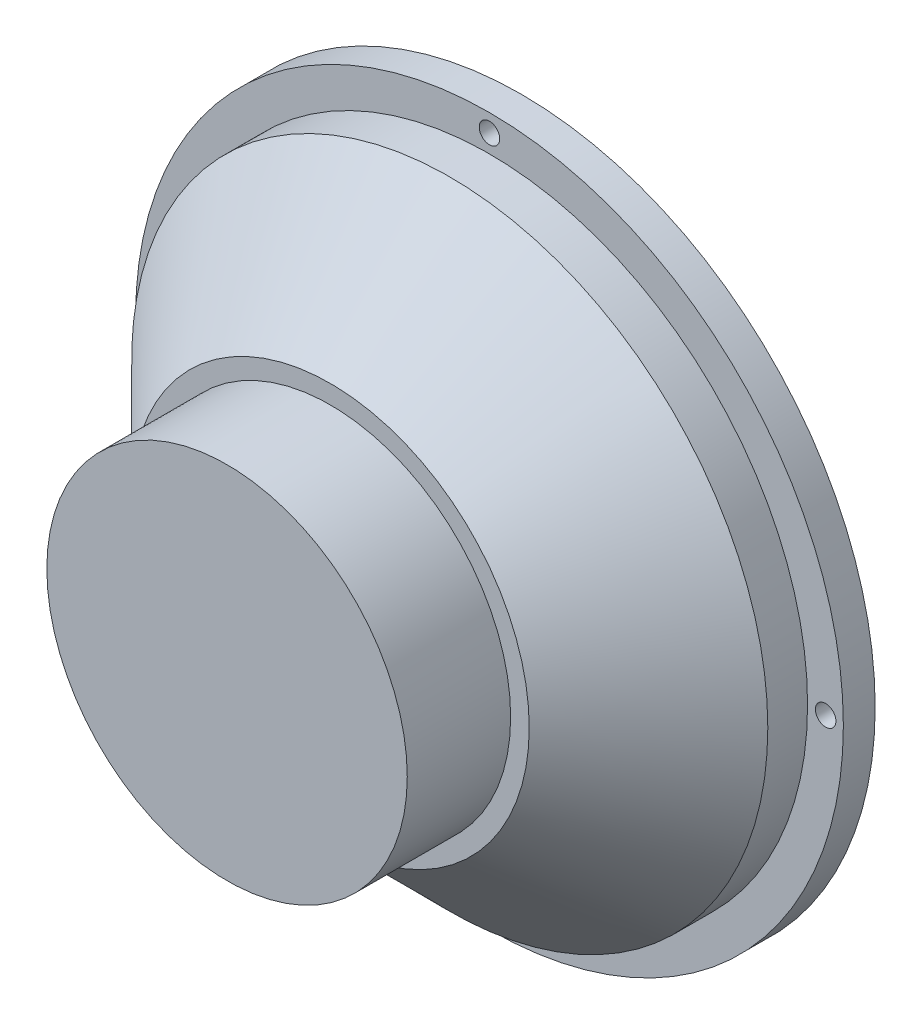
ISO-10303-21;
HEADER;
FILE_DESCRIPTION(('STEP AP214'),'2;1');
FILE_NAME('part.step','',(''),(''),'','','');
FILE_SCHEMA(('AUTOMOTIVE_DESIGN { 1 0 10303 214 1 1 1 1 }'));
ENDSEC;
DATA;
#1=APPLICATION_CONTEXT('core data for automotive mechanical design processes');
#2=APPLICATION_PROTOCOL_DEFINITION('international standard','automotive_design',2000,#1);
#3=PRODUCT_CONTEXT('',#1,'mechanical');
#4=PRODUCT('Part','Part','',(#3));
#5=PRODUCT_RELATED_PRODUCT_CATEGORY('part','',(#4));
#6=PRODUCT_DEFINITION_FORMATION('','',#4);
#7=PRODUCT_DEFINITION_CONTEXT('part definition',#1,'design');
#8=PRODUCT_DEFINITION('design','',#6,#7);
#9=PRODUCT_DEFINITION_SHAPE('','',#8);
#10=(LENGTH_UNIT() NAMED_UNIT(*) SI_UNIT(.MILLI.,.METRE.));
#11=(NAMED_UNIT(*) PLANE_ANGLE_UNIT() SI_UNIT($,.RADIAN.));
#12=(NAMED_UNIT(*) SI_UNIT($,.STERADIAN.) SOLID_ANGLE_UNIT());
#13=UNCERTAINTY_MEASURE_WITH_UNIT(LENGTH_MEASURE(1.E-05),#10,'distance_accuracy_value','');
#14=(GEOMETRIC_REPRESENTATION_CONTEXT(3) GLOBAL_UNCERTAINTY_ASSIGNED_CONTEXT((#13)) GLOBAL_UNIT_ASSIGNED_CONTEXT((#10,
#11,#12)) REPRESENTATION_CONTEXT('',''));
#15=CARTESIAN_POINT('',(0.,0.,0.));
#16=DIRECTION('',(0.,0.,1.));
#17=DIRECTION('',(1.,0.,0.));
#18=AXIS2_PLACEMENT_3D('',#15,#16,#17);
#19=CARTESIAN_POINT('',(0.,0.,8.));
#20=DIRECTION('',(0.,0.,-1.));
#21=DIRECTION('',(-1.,0.,0.));
#22=AXIS2_PLACEMENT_3D('',#19,#20,#21);
#23=CYLINDRICAL_SURFACE('',#22,89.);
#24=CARTESIAN_POINT('',(0.,0.,8.));
#25=DIRECTION('',(0.,0.,1.));
#26=DIRECTION('',(1.,0.,0.));
#27=AXIS2_PLACEMENT_3D('',#24,#25,#26);
#28=CIRCLE('',#27,89.);
#29=CARTESIAN_POINT('',(89.,0.,8.));
#30=VERTEX_POINT('',#29);
#31=EDGE_CURVE('E76',#30,#30,#28,.T.);
#32=ORIENTED_EDGE('',*,*,#31,.F.);
#33=EDGE_LOOP('',(#32));
#34=FACE_BOUND('',#33,.T.);
#35=CARTESIAN_POINT('',(0.,0.,0.));
#36=DIRECTION('',(0.,0.,1.));
#37=DIRECTION('',(1.,0.,0.));
#38=AXIS2_PLACEMENT_3D('',#35,#36,#37);
#39=CIRCLE('',#38,89.);
#40=CARTESIAN_POINT('',(89.,0.,0.));
#41=VERTEX_POINT('',#40);
#42=EDGE_CURVE('E80',#41,#41,#39,.T.);
#43=ORIENTED_EDGE('',*,*,#42,.T.);
#44=EDGE_LOOP('',(#43));
#45=FACE_BOUND('',#44,.T.);
#46=ADVANCED_FACE('F50',(#34,#45),#23,.T.);
#47=CARTESIAN_POINT('',(0.,0.,8.));
#48=DIRECTION('',(0.,0.,1.));
#49=DIRECTION('',(1.,0.,0.));
#50=AXIS2_PLACEMENT_3D('',#47,#48,#49);
#51=PLANE('',#50);
#52=CARTESIAN_POINT('',(3.26270494296871E-12,84.5479564843403,8.));
#53=DIRECTION('',(0.,0.,1.));
#54=DIRECTION('',(1.,0.,0.));
#55=AXIS2_PLACEMENT_3D('',#52,#53,#54);
#56=CIRCLE('',#55,2.57454191486641);
#57=CARTESIAN_POINT('',(2.57454191486967,84.5479564843403,8.));
#58=VERTEX_POINT('',#57);
#59=EDGE_CURVE('E92',#58,#58,#56,.T.);
#60=ORIENTED_EDGE('',*,*,#59,.F.);
#61=EDGE_LOOP('',(#60));
#62=FACE_BOUND('',#61,.T.);
#63=CARTESIAN_POINT('',(84.5479564843427,-8.75238698478862E-13,8.));
#64=DIRECTION('',(0.,0.,1.));
#65=DIRECTION('',(1.,0.,0.));
#66=AXIS2_PLACEMENT_3D('',#63,#64,#65);
#67=CIRCLE('',#66,2.57454191486828);
#68=CARTESIAN_POINT('',(87.122498399211,-8.75238698478862E-13,8.));
#69=VERTEX_POINT('',#68);
#70=EDGE_CURVE('E240',#69,#69,#67,.T.);
#71=ORIENTED_EDGE('',*,*,#70,.F.);
#72=EDGE_LOOP('',(#71));
#73=FACE_BOUND('',#72,.T.);
#74=CARTESIAN_POINT('',(1.51222754601099E-12,-84.5479564843403,8.));
#75=DIRECTION('',(0.,0.,1.));
#76=DIRECTION('',(1.,0.,0.));
#77=AXIS2_PLACEMENT_3D('',#74,#75,#76);
#78=CIRCLE('',#77,2.57454191487154);
#79=CARTESIAN_POINT('',(2.57454191487305,-84.5479564843403,8.));
#80=VERTEX_POINT('',#79);
#81=EDGE_CURVE('E244',#80,#80,#78,.T.);
#82=ORIENTED_EDGE('',*,*,#81,.F.);
#83=EDGE_LOOP('',(#82));
#84=FACE_BOUND('',#83,.T.);
#85=CARTESIAN_POINT('',(-84.547956484338,8.85592836907162E-13,8.));
#86=DIRECTION('',(0.,0.,1.));
#87=DIRECTION('',(1.,0.,0.));
#88=AXIS2_PLACEMENT_3D('',#85,#86,#87);
#89=CIRCLE('',#88,2.57454191487022);
#90=CARTESIAN_POINT('',(-81.9734145694678,8.85592836907162E-13,8.));
#91=VERTEX_POINT('',#90);
#92=EDGE_CURVE('E249',#91,#91,#89,.T.);
#93=ORIENTED_EDGE('',*,*,#92,.F.);
#94=EDGE_LOOP('',(#93));
#95=FACE_BOUND('',#94,.T.);
#96=CARTESIAN_POINT('',(0.,0.,8.));
#97=DIRECTION('',(0.,0.,1.));
#98=DIRECTION('',(1.,0.,0.));
#99=AXIS2_PLACEMENT_3D('',#96,#97,#98);
#100=CIRCLE('',#99,80.);
#101=CARTESIAN_POINT('',(80.,0.,8.));
#102=VERTEX_POINT('',#101);
#103=EDGE_CURVE('E72',#102,#102,#100,.T.);
#104=ORIENTED_EDGE('',*,*,#103,.F.);
#105=EDGE_LOOP('',(#104));
#106=FACE_BOUND('',#105,.T.);
#107=ORIENTED_EDGE('',*,*,#31,.T.);
#108=EDGE_LOOP('',(#107));
#109=FACE_BOUND('',#108,.T.);
#110=ADVANCED_FACE('F123',(#62,#73,#84,#95,#106,#109),#51,.T.);
#111=CARTESIAN_POINT('',(0.,0.,0.));
#112=DIRECTION('',(0.,0.,1.));
#113=DIRECTION('',(1.,0.,0.));
#114=AXIS2_PLACEMENT_3D('',#111,#112,#113);
#115=PLANE('',#114);
#116=CARTESIAN_POINT('',(3.26270494296871E-12,84.5479564843403,0.));
#117=DIRECTION('',(0.,0.,1.));
#118=DIRECTION('',(1.,0.,0.));
#119=AXIS2_PLACEMENT_3D('',#116,#117,#118);
#120=CIRCLE('',#119,2.57454191486641);
#121=CARTESIAN_POINT('',(2.57454191486967,84.5479564843403,0.));
#122=VERTEX_POINT('',#121);
#123=EDGE_CURVE('E55',#122,#122,#120,.T.);
#124=ORIENTED_EDGE('',*,*,#123,.T.);
#125=EDGE_LOOP('',(#124));
#126=FACE_BOUND('',#125,.T.);
#127=CARTESIAN_POINT('',(84.5479564843427,-8.75238698478862E-13,0.));
#128=DIRECTION('',(0.,0.,1.));
#129=DIRECTION('',(1.,0.,0.));
#130=AXIS2_PLACEMENT_3D('',#127,#128,#129);
#131=CIRCLE('',#130,2.57454191486828);
#132=CARTESIAN_POINT('',(87.122498399211,-8.75238698478862E-13,0.));
#133=VERTEX_POINT('',#132);
#134=EDGE_CURVE('E95',#133,#133,#131,.T.);
#135=ORIENTED_EDGE('',*,*,#134,.T.);
#136=EDGE_LOOP('',(#135));
#137=FACE_BOUND('',#136,.T.);
#138=CARTESIAN_POINT('',(1.51222754601099E-12,-84.5479564843403,0.));
#139=DIRECTION('',(0.,0.,1.));
#140=DIRECTION('',(1.,0.,0.));
#141=AXIS2_PLACEMENT_3D('',#138,#139,#140);
#142=CIRCLE('',#141,2.57454191487154);
#143=CARTESIAN_POINT('',(2.57454191487305,-84.5479564843403,0.));
#144=VERTEX_POINT('',#143);
#145=EDGE_CURVE('E91',#144,#144,#142,.T.);
#146=ORIENTED_EDGE('',*,*,#145,.T.);
#147=EDGE_LOOP('',(#146));
#148=FACE_BOUND('',#147,.T.);
#149=CARTESIAN_POINT('',(-84.547956484338,8.85592836907162E-13,0.));
#150=DIRECTION('',(0.,0.,1.));
#151=DIRECTION('',(1.,0.,0.));
#152=AXIS2_PLACEMENT_3D('',#149,#150,#151);
#153=CIRCLE('',#152,2.57454191487022);
#154=CARTESIAN_POINT('',(-81.9734145694678,8.85592836907162E-13,0.));
#155=VERTEX_POINT('',#154);
#156=EDGE_CURVE('E87',#155,#155,#153,.T.);
#157=ORIENTED_EDGE('',*,*,#156,.T.);
#158=EDGE_LOOP('',(#157));
#159=FACE_BOUND('',#158,.T.);
#160=ORIENTED_EDGE('',*,*,#42,.F.);
#161=EDGE_LOOP('',(#160));
#162=FACE_BOUND('',#161,.T.);
#163=ADVANCED_FACE('F129',(#126,#137,#148,#159,#162),#115,.F.);
#164=CARTESIAN_POINT('',(0.,0.,48.));
#165=DIRECTION('',(0.,0.,-1.));
#166=DIRECTION('',(-1.,0.,0.));
#167=AXIS2_PLACEMENT_3D('',#164,#165,#166);
#168=CYLINDRICAL_SURFACE('',#167,80.);
#169=CARTESIAN_POINT('',(0.,0.,17.9999999999999));
#170=DIRECTION('',(0.,0.,1.));
#171=DIRECTION('',(1.,0.,0.));
#172=AXIS2_PLACEMENT_3D('',#169,#170,#171);
#173=CIRCLE('',#172,80.);
#174=CARTESIAN_POINT('',(80.,0.,17.9999999999999));
#175=VERTEX_POINT('',#174);
#176=EDGE_CURVE('E60',#175,#175,#173,.F.);
#177=ORIENTED_EDGE('',*,*,#176,.T.);
#178=EDGE_LOOP('',(#177));
#179=FACE_BOUND('',#178,.T.);
#180=ORIENTED_EDGE('',*,*,#103,.T.);
#181=EDGE_LOOP('',(#180));
#182=FACE_BOUND('',#181,.T.);
#183=ADVANCED_FACE('F136',(#179,#182),#168,.T.);
#184=CARTESIAN_POINT('',(0.,0.,48.));
#185=DIRECTION('',(0.,0.,1.));
#186=DIRECTION('',(1.,0.,0.));
#187=AXIS2_PLACEMENT_3D('',#184,#185,#186);
#188=PLANE('',#187);
#189=CARTESIAN_POINT('',(0.,0.,48.));
#190=DIRECTION('',(0.,0.,1.));
#191=DIRECTION('',(1.,0.,0.));
#192=AXIS2_PLACEMENT_3D('',#189,#190,#191);
#193=CIRCLE('',#192,45.325276546488);
#194=CARTESIAN_POINT('',(45.325276546488,0.,48.));
#195=VERTEX_POINT('',#194);
#196=EDGE_CURVE('E10',#195,#195,#193,.T.);
#197=ORIENTED_EDGE('',*,*,#196,.F.);
#198=EDGE_LOOP('',(#197));
#199=FACE_BOUND('',#198,.T.);
#200=CARTESIAN_POINT('',(0.,0.,48.));
#201=DIRECTION('',(0.,0.,1.));
#202=DIRECTION('',(1.,0.,0.));
#203=AXIS2_PLACEMENT_3D('',#200,#201,#202);
#204=CIRCLE('',#203,50.);
#205=CARTESIAN_POINT('',(50.,0.,48.));
#206=VERTEX_POINT('',#205);
#207=EDGE_CURVE('E66',#206,#206,#204,.T.);
#208=ORIENTED_EDGE('',*,*,#207,.T.);
#209=EDGE_LOOP('',(#208));
#210=FACE_BOUND('',#209,.T.);
#211=ADVANCED_FACE('F119',(#199,#210),#188,.T.);
#212=CARTESIAN_POINT('',(0.,0.,48.));
#213=DIRECTION('',(0.,0.,-1.));
#214=DIRECTION('',(-1.,0.,0.));
#215=AXIS2_PLACEMENT_3D('',#212,#213,#214);
#216=CONICAL_SURFACE('',#215,50.,0.785398163397447);
#217=ORIENTED_EDGE('',*,*,#176,.F.);
#218=EDGE_LOOP('',(#217));
#219=FACE_BOUND('',#218,.T.);
#220=ORIENTED_EDGE('',*,*,#207,.F.);
#221=EDGE_LOOP('',(#220));
#222=FACE_BOUND('',#221,.T.);
#223=ADVANCED_FACE('F53',(#219,#222),#216,.T.);
#224=CARTESIAN_POINT('',(0.,0.,74.));
#225=DIRECTION('',(0.,0.,-1.));
#226=DIRECTION('',(-1.,0.,0.));
#227=AXIS2_PLACEMENT_3D('',#224,#225,#226);
#228=CYLINDRICAL_SURFACE('',#227,45.325276546488);
#229=CARTESIAN_POINT('',(0.,0.,74.));
#230=DIRECTION('',(0.,0.,1.));
#231=DIRECTION('',(1.,0.,0.));
#232=AXIS2_PLACEMENT_3D('',#229,#230,#231);
#233=CIRCLE('',#232,45.325276546488);
#234=CARTESIAN_POINT('',(45.325276546488,0.,74.));
#235=VERTEX_POINT('',#234);
#236=EDGE_CURVE('E70',#235,#235,#233,.T.);
#237=ORIENTED_EDGE('',*,*,#236,.F.);
#238=EDGE_LOOP('',(#237));
#239=FACE_BOUND('',#238,.T.);
#240=ORIENTED_EDGE('',*,*,#196,.T.);
#241=EDGE_LOOP('',(#240));
#242=FACE_BOUND('',#241,.T.);
#243=ADVANCED_FACE('F110',(#239,#242),#228,.T.);
#244=CARTESIAN_POINT('',(0.,0.,74.));
#245=DIRECTION('',(0.,0.,1.));
#246=DIRECTION('',(1.,0.,0.));
#247=AXIS2_PLACEMENT_3D('',#244,#245,#246);
#248=PLANE('',#247);
#249=ORIENTED_EDGE('',*,*,#236,.T.);
#250=EDGE_LOOP('',(#249));
#251=FACE_BOUND('',#250,.T.);
#252=ADVANCED_FACE('F108',(#251),#248,.T.);
#253=CARTESIAN_POINT('',(-84.547956484338,8.85592836907162E-13,-18.));
#254=DIRECTION('',(0.,0.,1.));
#255=DIRECTION('',(1.,0.,0.));
#256=AXIS2_PLACEMENT_3D('',#253,#254,#255);
#257=CYLINDRICAL_SURFACE('',#256,2.57454191487022);
#258=ORIENTED_EDGE('',*,*,#92,.T.);
#259=EDGE_LOOP('',(#258));
#260=FACE_BOUND('',#259,.T.);
#261=ORIENTED_EDGE('',*,*,#156,.F.);
#262=EDGE_LOOP('',(#261));
#263=FACE_BOUND('',#262,.T.);
#264=ADVANCED_FACE('F117',(#260,#263),#257,.F.);
#265=CARTESIAN_POINT('',(1.51222754601099E-12,-84.5479564843403,-18.));
#266=DIRECTION('',(0.,0.,1.));
#267=DIRECTION('',(1.,0.,0.));
#268=AXIS2_PLACEMENT_3D('',#265,#266,#267);
#269=CYLINDRICAL_SURFACE('',#268,2.57454191487154);
#270=ORIENTED_EDGE('',*,*,#81,.T.);
#271=EDGE_LOOP('',(#270));
#272=FACE_BOUND('',#271,.T.);
#273=ORIENTED_EDGE('',*,*,#145,.F.);
#274=EDGE_LOOP('',(#273));
#275=FACE_BOUND('',#274,.T.);
#276=ADVANCED_FACE('F183',(#272,#275),#269,.F.);
#277=CARTESIAN_POINT('',(84.5479564843427,-8.75238698478862E-13,-18.));
#278=DIRECTION('',(0.,0.,1.));
#279=DIRECTION('',(1.,0.,0.));
#280=AXIS2_PLACEMENT_3D('',#277,#278,#279);
#281=CYLINDRICAL_SURFACE('',#280,2.57454191486828);
#282=ORIENTED_EDGE('',*,*,#70,.T.);
#283=EDGE_LOOP('',(#282));
#284=FACE_BOUND('',#283,.T.);
#285=ORIENTED_EDGE('',*,*,#134,.F.);
#286=EDGE_LOOP('',(#285));
#287=FACE_BOUND('',#286,.T.);
#288=ADVANCED_FACE('F192',(#284,#287),#281,.F.);
#289=CARTESIAN_POINT('',(3.26270494296871E-12,84.5479564843403,-18.));
#290=DIRECTION('',(0.,0.,1.));
#291=DIRECTION('',(1.,0.,0.));
#292=AXIS2_PLACEMENT_3D('',#289,#290,#291);
#293=CYLINDRICAL_SURFACE('',#292,2.57454191486641);
#294=ORIENTED_EDGE('',*,*,#59,.T.);
#295=EDGE_LOOP('',(#294));
#296=FACE_BOUND('',#295,.T.);
#297=ORIENTED_EDGE('',*,*,#123,.F.);
#298=EDGE_LOOP('',(#297));
#299=FACE_BOUND('',#298,.T.);
#300=ADVANCED_FACE('F201',(#296,#299),#293,.F.);
#301=CLOSED_SHELL('',(#46,#110,#163,#183,#211,#223,#243,#252,#264,#276,#288,#300));
#302=MANIFOLD_SOLID_BREP('B2',#301);
#303=ADVANCED_BREP_SHAPE_REPRESENTATION('',(#18,#302),#14);
#304=SHAPE_DEFINITION_REPRESENTATION(#9,#303);
ENDSEC;
END-ISO-10303-21;
